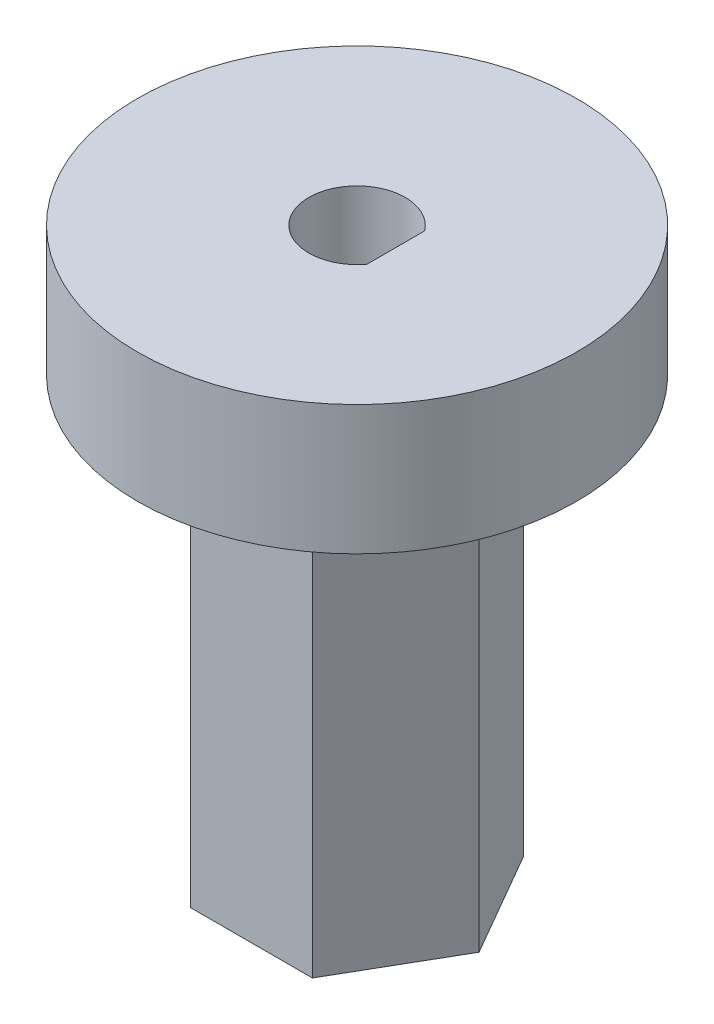
ISO-10303-21;
HEADER;
FILE_DESCRIPTION(('STEP AP214'),'2;1');
FILE_NAME('part.step','',(''),(''),'','','');
FILE_SCHEMA(('AUTOMOTIVE_DESIGN { 1 0 10303 214 1 1 1 1 }'));
ENDSEC;
DATA;
#1=APPLICATION_CONTEXT('core data for automotive mechanical design processes');
#2=APPLICATION_PROTOCOL_DEFINITION('international standard','automotive_design',2000,#1);
#3=PRODUCT_CONTEXT('',#1,'mechanical');
#4=PRODUCT('Part','Part','',(#3));
#5=PRODUCT_RELATED_PRODUCT_CATEGORY('part','',(#4));
#6=PRODUCT_DEFINITION_FORMATION('','',#4);
#7=PRODUCT_DEFINITION_CONTEXT('part definition',#1,'design');
#8=PRODUCT_DEFINITION('design','',#6,#7);
#9=PRODUCT_DEFINITION_SHAPE('','',#8);
#10=(LENGTH_UNIT() NAMED_UNIT(*) SI_UNIT(.MILLI.,.METRE.));
#11=(NAMED_UNIT(*) PLANE_ANGLE_UNIT() SI_UNIT($,.RADIAN.));
#12=(NAMED_UNIT(*) SI_UNIT($,.STERADIAN.) SOLID_ANGLE_UNIT());
#13=UNCERTAINTY_MEASURE_WITH_UNIT(LENGTH_MEASURE(1.E-05),#10,'distance_accuracy_value','');
#14=(GEOMETRIC_REPRESENTATION_CONTEXT(3) GLOBAL_UNCERTAINTY_ASSIGNED_CONTEXT((#13)) GLOBAL_UNIT_ASSIGNED_CONTEXT((#10,
#11,#12)) REPRESENTATION_CONTEXT('',''));
#15=CARTESIAN_POINT('',(0.,0.,0.));
#16=DIRECTION('',(0.,0.,1.));
#17=DIRECTION('',(1.,0.,0.));
#18=AXIS2_PLACEMENT_3D('',#15,#16,#17);
#19=CARTESIAN_POINT('',(0.,6.731,0.));
#20=DIRECTION('',(0.,-1.,0.));
#21=DIRECTION('',(0.,0.,-1.));
#22=AXIS2_PLACEMENT_3D('',#19,#20,#21);
#23=CYLINDRICAL_SURFACE('',#22,2.51159968952969);
#24=DIRECTION('',(0.,-1.,0.));
#25=VECTOR('',#24,1.);
#26=CARTESIAN_POINT('',(2.01458477638253,6.731,1.49986038657382));
#27=LINE('',#26,#25);
#28=CARTESIAN_POINT('',(2.01458477638253,6.731,1.49986038657382));
#29=VERTEX_POINT('',#28);
#30=CARTESIAN_POINT('',(2.01458477638253,-22.86,1.49986038657382));
#31=VERTEX_POINT('',#30);
#32=EDGE_CURVE('E54',#29,#31,#27,.T.);
#33=ORIENTED_EDGE('',*,*,#32,.T.);
#34=CARTESIAN_POINT('',(0.,-22.86,0.));
#35=DIRECTION('',(0.,1.,0.));
#36=DIRECTION('',(0.,0.,1.));
#37=AXIS2_PLACEMENT_3D('',#34,#35,#36);
#38=CIRCLE('',#37,2.51159968952969);
#39=CARTESIAN_POINT('',(2.01458477638253,-22.86,-1.49986038657382));
#40=VERTEX_POINT('',#39);
#41=EDGE_CURVE('E119',#40,#31,#38,.T.);
#42=ORIENTED_EDGE('',*,*,#41,.F.);
#43=DIRECTION('',(0.,-1.,0.));
#44=VECTOR('',#43,1.);
#45=CARTESIAN_POINT('',(2.01458477638253,6.731,-1.49986038657382));
#46=LINE('',#45,#44);
#47=CARTESIAN_POINT('',(2.01458477638253,6.731,-1.49986038657382));
#48=VERTEX_POINT('',#47);
#49=EDGE_CURVE('E11',#48,#40,#46,.T.);
#50=ORIENTED_EDGE('',*,*,#49,.F.);
#51=CARTESIAN_POINT('',(0.,6.731,0.));
#52=DIRECTION('',(0.,1.,0.));
#53=DIRECTION('',(0.,0.,1.));
#54=AXIS2_PLACEMENT_3D('',#51,#52,#53);
#55=CIRCLE('',#54,2.51159968952969);
#56=EDGE_CURVE('E194',#48,#29,#55,.T.);
#57=ORIENTED_EDGE('',*,*,#56,.T.);
#58=EDGE_LOOP('',(#33,#42,#50,#57));
#59=FACE_BOUND('',#58,.T.);
#60=ADVANCED_FACE('F45',(#59),#23,.F.);
#61=CARTESIAN_POINT('',(0.,6.731,0.));
#62=DIRECTION('',(0.,-1.,0.));
#63=DIRECTION('',(0.,0.,-1.));
#64=AXIS2_PLACEMENT_3D('',#61,#62,#63);
#65=CYLINDRICAL_SURFACE('',#64,11.43);
#66=CARTESIAN_POINT('',(0.,6.731,0.));
#67=DIRECTION('',(0.,1.,0.));
#68=DIRECTION('',(0.,0.,1.));
#69=AXIS2_PLACEMENT_3D('',#66,#67,#68);
#70=CIRCLE('',#69,11.43);
#71=CARTESIAN_POINT('',(0.,6.731,11.43));
#72=VERTEX_POINT('',#71);
#73=EDGE_CURVE('E190',#72,#72,#70,.T.);
#74=ORIENTED_EDGE('',*,*,#73,.F.);
#75=EDGE_LOOP('',(#74));
#76=FACE_BOUND('',#75,.T.);
#77=CARTESIAN_POINT('',(0.,0.,0.));
#78=DIRECTION('',(0.,1.,0.));
#79=DIRECTION('',(0.,0.,1.));
#80=AXIS2_PLACEMENT_3D('',#77,#78,#79);
#81=CIRCLE('',#80,11.43);
#82=CARTESIAN_POINT('',(0.,0.,11.43));
#83=VERTEX_POINT('',#82);
#84=EDGE_CURVE('E175',#83,#83,#81,.T.);
#85=ORIENTED_EDGE('',*,*,#84,.T.);
#86=EDGE_LOOP('',(#85));
#87=FACE_BOUND('',#86,.T.);
#88=ADVANCED_FACE('F47',(#76,#87),#65,.T.);
#89=CARTESIAN_POINT('',(2.01458477638253,6.731,0.));
#90=DIRECTION('',(-1.,0.,0.));
#91=DIRECTION('',(0.,0.,1.));
#92=AXIS2_PLACEMENT_3D('',#89,#90,#91);
#93=PLANE('',#92);
#94=ORIENTED_EDGE('',*,*,#49,.T.);
#95=DIRECTION('',(0.,0.,-1.));
#96=VECTOR('',#95,1.);
#97=CARTESIAN_POINT('',(2.01458477638253,-22.86,0.));
#98=LINE('',#97,#96);
#99=EDGE_CURVE('E109',#31,#40,#98,.T.);
#100=ORIENTED_EDGE('',*,*,#99,.F.);
#101=ORIENTED_EDGE('',*,*,#32,.F.);
#102=DIRECTION('',(0.,0.,-1.));
#103=VECTOR('',#102,1.);
#104=CARTESIAN_POINT('',(2.01458477638253,6.731,0.));
#105=LINE('',#104,#103);
#106=EDGE_CURVE('E112',#29,#48,#105,.T.);
#107=ORIENTED_EDGE('',*,*,#106,.T.);
#108=EDGE_LOOP('',(#94,#100,#101,#107));
#109=FACE_BOUND('',#108,.T.);
#110=ADVANCED_FACE('F108',(#109),#93,.T.);
#111=CARTESIAN_POINT('',(0.,6.731,0.));
#112=DIRECTION('',(0.,1.,0.));
#113=DIRECTION('',(0.,0.,1.));
#114=AXIS2_PLACEMENT_3D('',#111,#112,#113);
#115=PLANE('',#114);
#116=ORIENTED_EDGE('',*,*,#73,.T.);
#117=EDGE_LOOP('',(#116));
#118=FACE_BOUND('',#117,.T.);
#119=ORIENTED_EDGE('',*,*,#56,.F.);
#120=ORIENTED_EDGE('',*,*,#106,.F.);
#121=EDGE_LOOP('',(#119,#120));
#122=FACE_BOUND('',#121,.T.);
#123=ADVANCED_FACE('F208',(#118,#122),#115,.T.);
#124=CARTESIAN_POINT('',(0.,0.,0.));
#125=DIRECTION('',(0.,1.,0.));
#126=DIRECTION('',(0.,0.,1.));
#127=AXIS2_PLACEMENT_3D('',#124,#125,#126);
#128=PLANE('',#127);
#129=DIRECTION('',(-1.,0.,0.));
#130=VECTOR('',#129,1.);
#131=CARTESIAN_POINT('',(0.,0.,-5.49926131403118));
#132=LINE('',#131,#130);
#133=CARTESIAN_POINT('',(3.175,0.,-5.49926131403118));
#134=VERTEX_POINT('',#133);
#135=CARTESIAN_POINT('',(-3.175,0.,-5.49926131403118));
#136=VERTEX_POINT('',#135);
#137=EDGE_CURVE('E124',#134,#136,#132,.T.);
#138=ORIENTED_EDGE('',*,*,#137,.T.);
#139=DIRECTION('',(-0.5,0.,0.866025403784439));
#140=VECTOR('',#139,1.);
#141=CARTESIAN_POINT('',(-4.7625,0.,-2.74963065701559));
#142=LINE('',#141,#140);
#143=CARTESIAN_POINT('',(-6.35,0.,0.));
#144=VERTEX_POINT('',#143);
#145=EDGE_CURVE('E155',#136,#144,#142,.T.);
#146=ORIENTED_EDGE('',*,*,#145,.T.);
#147=DIRECTION('',(0.5,0.,0.866025403784439));
#148=VECTOR('',#147,1.);
#149=CARTESIAN_POINT('',(-4.7625,0.,2.74963065701559));
#150=LINE('',#149,#148);
#151=CARTESIAN_POINT('',(-3.175,0.,5.49926131403119));
#152=VERTEX_POINT('',#151);
#153=EDGE_CURVE('E159',#144,#152,#150,.T.);
#154=ORIENTED_EDGE('',*,*,#153,.T.);
#155=DIRECTION('',(1.,0.,0.));
#156=VECTOR('',#155,1.);
#157=CARTESIAN_POINT('',(0.,0.,5.49926131403119));
#158=LINE('',#157,#156);
#159=CARTESIAN_POINT('',(3.175,0.,5.49926131403119));
#160=VERTEX_POINT('',#159);
#161=EDGE_CURVE('E61',#152,#160,#158,.T.);
#162=ORIENTED_EDGE('',*,*,#161,.T.);
#163=DIRECTION('',(0.5,0.,-0.866025403784439));
#164=VECTOR('',#163,1.);
#165=CARTESIAN_POINT('',(4.7625,0.,2.74963065701559));
#166=LINE('',#165,#164);
#167=CARTESIAN_POINT('',(6.35,0.,0.));
#168=VERTEX_POINT('',#167);
#169=EDGE_CURVE('E165',#160,#168,#166,.T.);
#170=ORIENTED_EDGE('',*,*,#169,.T.);
#171=DIRECTION('',(-0.5,0.,-0.866025403784439));
#172=VECTOR('',#171,1.);
#173=CARTESIAN_POINT('',(4.7625,0.,-2.74963065701559));
#174=LINE('',#173,#172);
#175=EDGE_CURVE('E128',#168,#134,#174,.T.);
#176=ORIENTED_EDGE('',*,*,#175,.T.);
#177=EDGE_LOOP('',(#138,#146,#154,#162,#170,#176));
#178=FACE_BOUND('',#177,.T.);
#179=ORIENTED_EDGE('',*,*,#84,.F.);
#180=EDGE_LOOP('',(#179));
#181=FACE_BOUND('',#180,.T.);
#182=ADVANCED_FACE('F205',(#178,#181),#128,.F.);
#183=CARTESIAN_POINT('',(-4.7625,-22.86,-2.74963065701559));
#184=DIRECTION('',(-0.866025403784439,0.,-0.5));
#185=DIRECTION('',(-0.5,0.,0.866025403784439));
#186=AXIS2_PLACEMENT_3D('',#183,#184,#185);
#187=PLANE('',#186);
#188=ORIENTED_EDGE('',*,*,#145,.F.);
#189=DIRECTION('',(0.,1.,0.));
#190=VECTOR('',#189,1.);
#191=CARTESIAN_POINT('',(-3.175,-22.86,-5.49926131403118));
#192=LINE('',#191,#190);
#193=CARTESIAN_POINT('',(-3.175,-22.86,-5.49926131403118));
#194=VERTEX_POINT('',#193);
#195=EDGE_CURVE('E172',#194,#136,#192,.T.);
#196=ORIENTED_EDGE('',*,*,#195,.F.);
#197=DIRECTION('',(-0.5,0.,0.866025403784439));
#198=VECTOR('',#197,1.);
#199=CARTESIAN_POINT('',(-4.7625,-22.86,-2.74963065701559));
#200=LINE('',#199,#198);
#201=CARTESIAN_POINT('',(-6.35,-22.86,0.));
#202=VERTEX_POINT('',#201);
#203=EDGE_CURVE('E121',#194,#202,#200,.T.);
#204=ORIENTED_EDGE('',*,*,#203,.T.);
#205=DIRECTION('',(0.,1.,0.));
#206=VECTOR('',#205,1.);
#207=CARTESIAN_POINT('',(-6.35,-22.86,0.));
#208=LINE('',#207,#206);
#209=EDGE_CURVE('E154',#202,#144,#208,.T.);
#210=ORIENTED_EDGE('',*,*,#209,.T.);
#211=EDGE_LOOP('',(#188,#196,#204,#210));
#212=FACE_BOUND('',#211,.T.);
#213=ADVANCED_FACE('F207',(#212),#187,.T.);
#214=CARTESIAN_POINT('',(0.,-22.86,-5.49926131403118));
#215=DIRECTION('',(0.,0.,-1.));
#216=DIRECTION('',(-1.,0.,0.));
#217=AXIS2_PLACEMENT_3D('',#214,#215,#216);
#218=PLANE('',#217);
#219=ORIENTED_EDGE('',*,*,#137,.F.);
#220=DIRECTION('',(0.,1.,0.));
#221=VECTOR('',#220,1.);
#222=CARTESIAN_POINT('',(3.175,-22.86,-5.49926131403118));
#223=LINE('',#222,#221);
#224=CARTESIAN_POINT('',(3.175,-22.86,-5.49926131403118));
#225=VERTEX_POINT('',#224);
#226=EDGE_CURVE('E176',#225,#134,#223,.T.);
#227=ORIENTED_EDGE('',*,*,#226,.F.);
#228=DIRECTION('',(-1.,0.,0.));
#229=VECTOR('',#228,1.);
#230=CARTESIAN_POINT('',(0.,-22.86,-5.49926131403118));
#231=LINE('',#230,#229);
#232=EDGE_CURVE('E150',#225,#194,#231,.T.);
#233=ORIENTED_EDGE('',*,*,#232,.T.);
#234=ORIENTED_EDGE('',*,*,#195,.T.);
#235=EDGE_LOOP('',(#219,#227,#233,#234));
#236=FACE_BOUND('',#235,.T.);
#237=ADVANCED_FACE('F215',(#236),#218,.T.);
#238=CARTESIAN_POINT('',(4.7625,-22.86,-2.74963065701559));
#239=DIRECTION('',(0.866025403784438,0.,-0.5));
#240=DIRECTION('',(-0.5,0.,-0.866025403784439));
#241=AXIS2_PLACEMENT_3D('',#238,#239,#240);
#242=PLANE('',#241);
#243=ORIENTED_EDGE('',*,*,#175,.F.);
#244=DIRECTION('',(0.,1.,0.));
#245=VECTOR('',#244,1.);
#246=CARTESIAN_POINT('',(6.35,-22.86,0.));
#247=LINE('',#246,#245);
#248=CARTESIAN_POINT('',(6.35,-22.86,0.));
#249=VERTEX_POINT('',#248);
#250=EDGE_CURVE('E179',#249,#168,#247,.T.);
#251=ORIENTED_EDGE('',*,*,#250,.F.);
#252=DIRECTION('',(-0.5,0.,-0.866025403784439));
#253=VECTOR('',#252,1.);
#254=CARTESIAN_POINT('',(4.7625,-22.86,-2.74963065701559));
#255=LINE('',#254,#253);
#256=EDGE_CURVE('E146',#249,#225,#255,.T.);
#257=ORIENTED_EDGE('',*,*,#256,.T.);
#258=ORIENTED_EDGE('',*,*,#226,.T.);
#259=EDGE_LOOP('',(#243,#251,#257,#258));
#260=FACE_BOUND('',#259,.T.);
#261=ADVANCED_FACE('F253',(#260),#242,.T.);
#262=CARTESIAN_POINT('',(4.7625,-22.86,2.74963065701559));
#263=DIRECTION('',(0.866025403784439,0.,0.5));
#264=DIRECTION('',(0.5,0.,-0.866025403784439));
#265=AXIS2_PLACEMENT_3D('',#262,#263,#264);
#266=PLANE('',#265);
#267=ORIENTED_EDGE('',*,*,#169,.F.);
#268=DIRECTION('',(0.,1.,0.));
#269=VECTOR('',#268,1.);
#270=CARTESIAN_POINT('',(3.175,-22.86,5.49926131403119));
#271=LINE('',#270,#269);
#272=CARTESIAN_POINT('',(3.175,-22.86,5.49926131403119));
#273=VERTEX_POINT('',#272);
#274=EDGE_CURVE('E182',#273,#160,#271,.T.);
#275=ORIENTED_EDGE('',*,*,#274,.F.);
#276=DIRECTION('',(0.5,0.,-0.866025403784439));
#277=VECTOR('',#276,1.);
#278=CARTESIAN_POINT('',(4.7625,-22.86,2.74963065701559));
#279=LINE('',#278,#277);
#280=EDGE_CURVE('E142',#273,#249,#279,.T.);
#281=ORIENTED_EDGE('',*,*,#280,.T.);
#282=ORIENTED_EDGE('',*,*,#250,.T.);
#283=EDGE_LOOP('',(#267,#275,#281,#282));
#284=FACE_BOUND('',#283,.T.);
#285=ADVANCED_FACE('F263',(#284),#266,.T.);
#286=CARTESIAN_POINT('',(0.,-22.86,5.49926131403119));
#287=DIRECTION('',(0.,0.,1.));
#288=DIRECTION('',(1.,0.,0.));
#289=AXIS2_PLACEMENT_3D('',#286,#287,#288);
#290=PLANE('',#289);
#291=ORIENTED_EDGE('',*,*,#161,.F.);
#292=DIRECTION('',(0.,1.,0.));
#293=VECTOR('',#292,1.);
#294=CARTESIAN_POINT('',(-3.175,-22.86,5.49926131403119));
#295=LINE('',#294,#293);
#296=CARTESIAN_POINT('',(-3.175,-22.86,5.49926131403119));
#297=VERTEX_POINT('',#296);
#298=EDGE_CURVE('E185',#297,#152,#295,.T.);
#299=ORIENTED_EDGE('',*,*,#298,.F.);
#300=DIRECTION('',(1.,0.,0.));
#301=VECTOR('',#300,1.);
#302=CARTESIAN_POINT('',(0.,-22.86,5.49926131403119));
#303=LINE('',#302,#301);
#304=EDGE_CURVE('E138',#297,#273,#303,.T.);
#305=ORIENTED_EDGE('',*,*,#304,.T.);
#306=ORIENTED_EDGE('',*,*,#274,.T.);
#307=EDGE_LOOP('',(#291,#299,#305,#306));
#308=FACE_BOUND('',#307,.T.);
#309=ADVANCED_FACE('F273',(#308),#290,.T.);
#310=CARTESIAN_POINT('',(-4.7625,-22.86,2.74963065701559));
#311=DIRECTION('',(-0.866025403784439,0.,0.5));
#312=DIRECTION('',(0.5,0.,0.866025403784439));
#313=AXIS2_PLACEMENT_3D('',#310,#311,#312);
#314=PLANE('',#313);
#315=ORIENTED_EDGE('',*,*,#153,.F.);
#316=ORIENTED_EDGE('',*,*,#209,.F.);
#317=DIRECTION('',(0.5,0.,0.866025403784439));
#318=VECTOR('',#317,1.);
#319=CARTESIAN_POINT('',(-4.7625,-22.86,2.74963065701559));
#320=LINE('',#319,#318);
#321=EDGE_CURVE('E134',#202,#297,#320,.T.);
#322=ORIENTED_EDGE('',*,*,#321,.T.);
#323=ORIENTED_EDGE('',*,*,#298,.T.);
#324=EDGE_LOOP('',(#315,#316,#322,#323));
#325=FACE_BOUND('',#324,.T.);
#326=ADVANCED_FACE('F283',(#325),#314,.T.);
#327=CARTESIAN_POINT('',(0.,-22.86,0.));
#328=DIRECTION('',(0.,1.,0.));
#329=DIRECTION('',(0.,0.,1.));
#330=AXIS2_PLACEMENT_3D('',#327,#328,#329);
#331=PLANE('',#330);
#332=ORIENTED_EDGE('',*,*,#41,.T.);
#333=ORIENTED_EDGE('',*,*,#99,.T.);
#334=EDGE_LOOP('',(#332,#333));
#335=FACE_BOUND('',#334,.T.);
#336=ORIENTED_EDGE('',*,*,#203,.F.);
#337=ORIENTED_EDGE('',*,*,#232,.F.);
#338=ORIENTED_EDGE('',*,*,#256,.F.);
#339=ORIENTED_EDGE('',*,*,#280,.F.);
#340=ORIENTED_EDGE('',*,*,#304,.F.);
#341=ORIENTED_EDGE('',*,*,#321,.F.);
#342=EDGE_LOOP('',(#336,#337,#338,#339,#340,#341));
#343=FACE_BOUND('',#342,.T.);
#344=ADVANCED_FACE('F117',(#335,#343),#331,.F.);
#345=CLOSED_SHELL('',(#60,#88,#110,#123,#182,#213,#237,#261,#285,#309,#326,#344));
#346=MANIFOLD_SOLID_BREP('B2',#345);
#347=ADVANCED_BREP_SHAPE_REPRESENTATION('',(#18,#346),#14);
#348=SHAPE_DEFINITION_REPRESENTATION(#9,#347);
ENDSEC;
END-ISO-10303-21;
